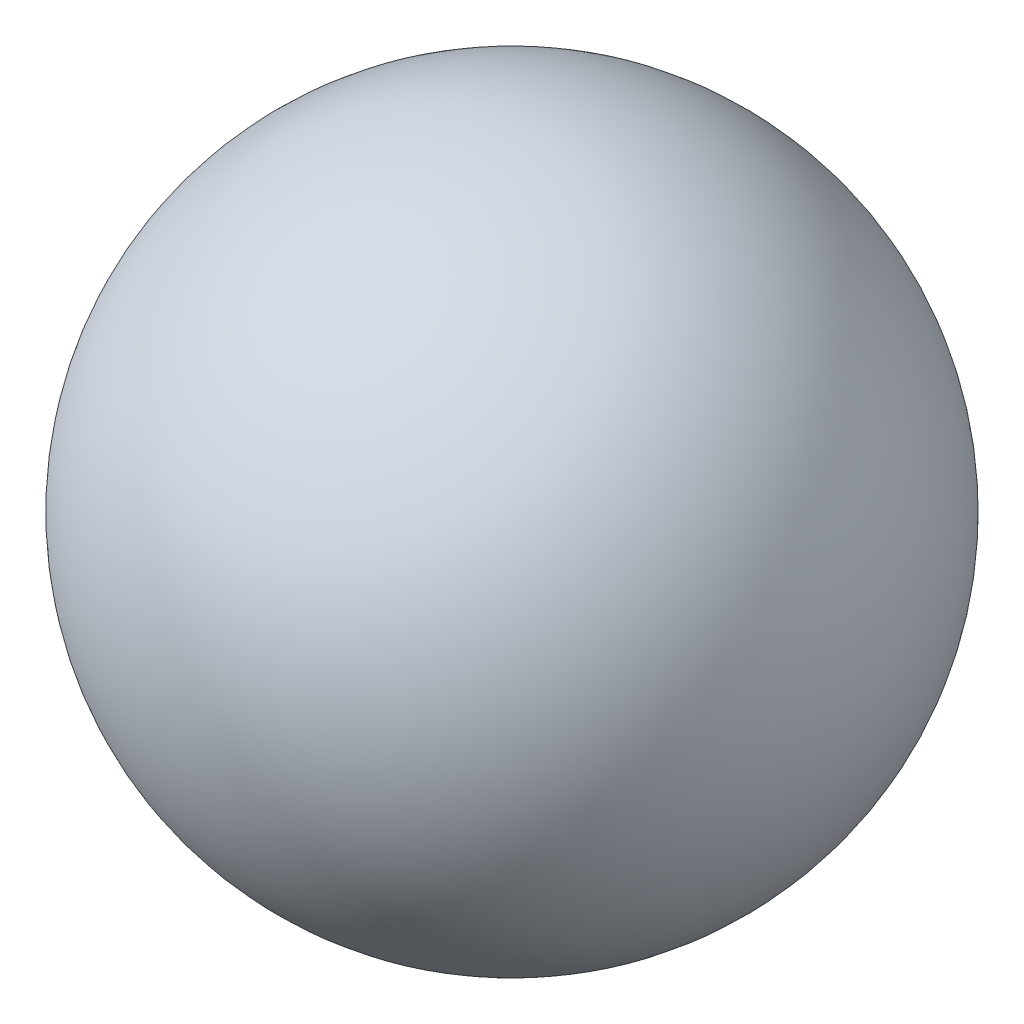
ISO-10303-21;
HEADER;
FILE_DESCRIPTION(('STEP AP214'),'2;1');
FILE_NAME('part.step','',(''),(''),'','','');
FILE_SCHEMA(('AUTOMOTIVE_DESIGN { 1 0 10303 214 1 1 1 1 }'));
ENDSEC;
DATA;
#1=APPLICATION_CONTEXT('core data for automotive mechanical design processes');
#2=APPLICATION_PROTOCOL_DEFINITION('international standard','automotive_design',2000,#1);
#3=PRODUCT_CONTEXT('',#1,'mechanical');
#4=PRODUCT('Part','Part','',(#3));
#5=PRODUCT_RELATED_PRODUCT_CATEGORY('part','',(#4));
#6=PRODUCT_DEFINITION_FORMATION('','',#4);
#7=PRODUCT_DEFINITION_CONTEXT('part definition',#1,'design');
#8=PRODUCT_DEFINITION('design','',#6,#7);
#9=PRODUCT_DEFINITION_SHAPE('','',#8);
#10=(LENGTH_UNIT() NAMED_UNIT(*) SI_UNIT(.MILLI.,.METRE.));
#11=(NAMED_UNIT(*) PLANE_ANGLE_UNIT() SI_UNIT($,.RADIAN.));
#12=(NAMED_UNIT(*) SI_UNIT($,.STERADIAN.) SOLID_ANGLE_UNIT());
#13=UNCERTAINTY_MEASURE_WITH_UNIT(LENGTH_MEASURE(1.E-05),#10,'distance_accuracy_value','');
#14=(GEOMETRIC_REPRESENTATION_CONTEXT(3) GLOBAL_UNCERTAINTY_ASSIGNED_CONTEXT((#13)) GLOBAL_UNIT_ASSIGNED_CONTEXT((#10,
#11,#12)) REPRESENTATION_CONTEXT('',''));
#15=CARTESIAN_POINT('',(0.,0.,0.));
#16=DIRECTION('',(0.,0.,1.));
#17=DIRECTION('',(1.,0.,0.));
#18=AXIS2_PLACEMENT_3D('',#15,#16,#17);
#19=CARTESIAN_POINT('',(0.,0.,0.));
#20=DIRECTION('',(0.,-1.,0.));
#21=DIRECTION('',(-1.,0.,0.));
#22=AXIS2_PLACEMENT_3D('',#19,#20,#21);
#23=SPHERICAL_SURFACE('',#22,12.);
#24=CARTESIAN_POINT('',(0.,-12.,0.));
#25=VERTEX_POINT('',#24);
#26=VERTEX_LOOP('',#25);
#27=FACE_BOUND('',#26,.T.);
#28=ADVANCED_FACE('F32',(#27),#23,.T.);
#29=CLOSED_SHELL('',(#28));
#30=MANIFOLD_SOLID_BREP('B2',#29);
#31=ADVANCED_BREP_SHAPE_REPRESENTATION('',(#18,#30),#14);
#32=SHAPE_DEFINITION_REPRESENTATION(#9,#31);
ENDSEC;
END-ISO-10303-21;
